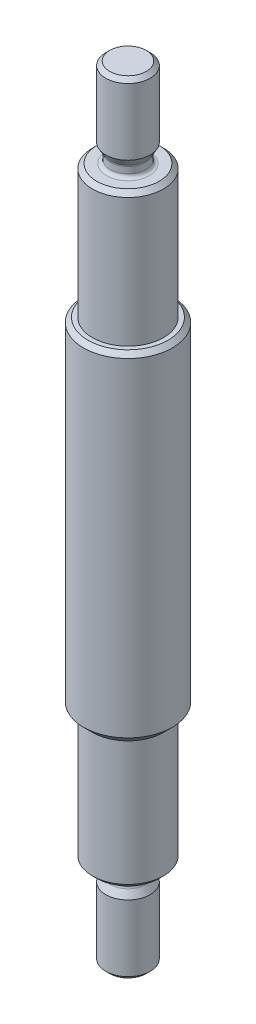
ISO-10303-21;
HEADER;
FILE_DESCRIPTION(('STEP AP214'),'2;1');
FILE_NAME('part.step','',(''),(''),'','','');
FILE_SCHEMA(('AUTOMOTIVE_DESIGN { 1 0 10303 214 1 1 1 1 }'));
ENDSEC;
DATA;
#1=APPLICATION_CONTEXT('core data for automotive mechanical design processes');
#2=APPLICATION_PROTOCOL_DEFINITION('international standard','automotive_design',2000,#1);
#3=PRODUCT_CONTEXT('',#1,'mechanical');
#4=PRODUCT('Part','Part','',(#3));
#5=PRODUCT_RELATED_PRODUCT_CATEGORY('part','',(#4));
#6=PRODUCT_DEFINITION_FORMATION('','',#4);
#7=PRODUCT_DEFINITION_CONTEXT('part definition',#1,'design');
#8=PRODUCT_DEFINITION('design','',#6,#7);
#9=PRODUCT_DEFINITION_SHAPE('','',#8);
#10=(LENGTH_UNIT() NAMED_UNIT(*) SI_UNIT(.MILLI.,.METRE.));
#11=(NAMED_UNIT(*) PLANE_ANGLE_UNIT() SI_UNIT($,.RADIAN.));
#12=(NAMED_UNIT(*) SI_UNIT($,.STERADIAN.) SOLID_ANGLE_UNIT());
#13=UNCERTAINTY_MEASURE_WITH_UNIT(LENGTH_MEASURE(1.E-05),#10,'distance_accuracy_value','');
#14=(GEOMETRIC_REPRESENTATION_CONTEXT(3) GLOBAL_UNCERTAINTY_ASSIGNED_CONTEXT((#13)) GLOBAL_UNIT_ASSIGNED_CONTEXT((#10,
#11,#12)) REPRESENTATION_CONTEXT('',''));
#15=CARTESIAN_POINT('',(0.,0.,0.));
#16=DIRECTION('',(0.,0.,1.));
#17=DIRECTION('',(1.,0.,0.));
#18=AXIS2_PLACEMENT_3D('',#15,#16,#17);
#19=CARTESIAN_POINT('',(0.,19.,0.));
#20=DIRECTION('',(0.,-1.,0.));
#21=DIRECTION('',(0.,0.,-1.));
#22=AXIS2_PLACEMENT_3D('',#19,#20,#21);
#23=CYLINDRICAL_SURFACE('',#22,5.);
#24=CARTESIAN_POINT('',(0.,18.5,0.));
#25=DIRECTION('',(0.,1.,0.));
#26=DIRECTION('',(0.,0.,1.));
#27=AXIS2_PLACEMENT_3D('',#24,#25,#26);
#28=CIRCLE('',#27,5.);
#29=CARTESIAN_POINT('',(0.,18.5,5.));
#30=VERTEX_POINT('',#29);
#31=EDGE_CURVE('E10',#30,#30,#28,.F.);
#32=ORIENTED_EDGE('',*,*,#31,.T.);
#33=EDGE_LOOP('',(#32));
#34=FACE_BOUND('',#33,.T.);
#35=CARTESIAN_POINT('',(0.,-18.5,0.));
#36=DIRECTION('',(0.,1.,0.));
#37=DIRECTION('',(0.,0.,1.));
#38=AXIS2_PLACEMENT_3D('',#35,#36,#37);
#39=CIRCLE('',#38,5.);
#40=CARTESIAN_POINT('',(0.,-18.5,5.));
#41=VERTEX_POINT('',#40);
#42=EDGE_CURVE('E53',#41,#41,#39,.T.);
#43=ORIENTED_EDGE('',*,*,#42,.T.);
#44=EDGE_LOOP('',(#43));
#45=FACE_BOUND('',#44,.T.);
#46=ADVANCED_FACE('F43',(#34,#45),#23,.T.);
#47=CARTESIAN_POINT('',(0.,19.,0.));
#48=DIRECTION('',(0.,1.,0.));
#49=DIRECTION('',(0.,0.,1.));
#50=AXIS2_PLACEMENT_3D('',#47,#48,#49);
#51=PLANE('',#50);
#52=CARTESIAN_POINT('',(0.,19.,0.));
#53=DIRECTION('',(0.,1.,0.));
#54=DIRECTION('',(0.,0.,1.));
#55=AXIS2_PLACEMENT_3D('',#52,#53,#54);
#56=CIRCLE('',#55,4.5);
#57=CARTESIAN_POINT('',(0.,19.,4.5));
#58=VERTEX_POINT('',#57);
#59=EDGE_CURVE('E58',#58,#58,#56,.T.);
#60=ORIENTED_EDGE('',*,*,#59,.T.);
#61=EDGE_LOOP('',(#60));
#62=FACE_BOUND('',#61,.T.);
#63=CARTESIAN_POINT('',(0.,19.,0.));
#64=DIRECTION('',(0.,1.,0.));
#65=DIRECTION('',(0.,0.,1.));
#66=AXIS2_PLACEMENT_3D('',#63,#64,#65);
#67=CIRCLE('',#66,4.);
#68=CARTESIAN_POINT('',(0.,19.,4.));
#69=VERTEX_POINT('',#68);
#70=EDGE_CURVE('E84',#69,#69,#67,.T.);
#71=ORIENTED_EDGE('',*,*,#70,.F.);
#72=EDGE_LOOP('',(#71));
#73=FACE_BOUND('',#72,.T.);
#74=ADVANCED_FACE('F162',(#62,#73),#51,.T.);
#75=CARTESIAN_POINT('',(0.,34.,0.));
#76=DIRECTION('',(0.,-1.,0.));
#77=DIRECTION('',(0.,0.,-1.));
#78=AXIS2_PLACEMENT_3D('',#75,#76,#77);
#79=CYLINDRICAL_SURFACE('',#78,4.);
#80=CARTESIAN_POINT('',(0.,33.5,0.));
#81=DIRECTION('',(0.,1.,0.));
#82=DIRECTION('',(0.,0.,1.));
#83=AXIS2_PLACEMENT_3D('',#80,#81,#82);
#84=CIRCLE('',#83,4.);
#85=CARTESIAN_POINT('',(0.,33.5,4.));
#86=VERTEX_POINT('',#85);
#87=EDGE_CURVE('E64',#86,#86,#84,.F.);
#88=ORIENTED_EDGE('',*,*,#87,.T.);
#89=EDGE_LOOP('',(#88));
#90=FACE_BOUND('',#89,.T.);
#91=ORIENTED_EDGE('',*,*,#70,.T.);
#92=EDGE_LOOP('',(#91));
#93=FACE_BOUND('',#92,.T.);
#94=ADVANCED_FACE('F167',(#90,#93),#79,.T.);
#95=CARTESIAN_POINT('',(0.,34.,0.));
#96=DIRECTION('',(0.,1.,0.));
#97=DIRECTION('',(0.,0.,1.));
#98=AXIS2_PLACEMENT_3D('',#95,#96,#97);
#99=PLANE('',#98);
#100=CARTESIAN_POINT('',(0.,34.,0.));
#101=DIRECTION('',(0.,1.,0.));
#102=DIRECTION('',(0.,0.,1.));
#103=AXIS2_PLACEMENT_3D('',#100,#101,#102);
#104=CIRCLE('',#103,3.5);
#105=CARTESIAN_POINT('',(0.,34.,3.5));
#106=VERTEX_POINT('',#105);
#107=EDGE_CURVE('E68',#106,#106,#104,.T.);
#108=ORIENTED_EDGE('',*,*,#107,.T.);
#109=EDGE_LOOP('',(#108));
#110=FACE_BOUND('',#109,.T.);
#111=CARTESIAN_POINT('',(0.,34.,0.));
#112=DIRECTION('',(0.,-1.,0.));
#113=DIRECTION('',(0.,0.,-1.));
#114=AXIS2_PLACEMENT_3D('',#111,#112,#113);
#115=CIRCLE('',#114,2.4);
#116=CARTESIAN_POINT('',(0.,34.,-2.4));
#117=VERTEX_POINT('',#116);
#118=EDGE_CURVE('E132',#117,#117,#115,.T.);
#119=ORIENTED_EDGE('',*,*,#118,.T.);
#120=EDGE_LOOP('',(#119));
#121=FACE_BOUND('',#120,.T.);
#122=ADVANCED_FACE('F209',(#110,#121),#99,.T.);
#123=CARTESIAN_POINT('',(0.,-34.,0.));
#124=DIRECTION('',(0.,1.,0.));
#125=DIRECTION('',(0.,0.,1.));
#126=AXIS2_PLACEMENT_3D('',#123,#124,#125);
#127=CYLINDRICAL_SURFACE('',#126,4.);
#128=CARTESIAN_POINT('',(0.,-19.5,0.));
#129=DIRECTION('',(0.,1.,0.));
#130=DIRECTION('',(0.,0.,1.));
#131=AXIS2_PLACEMENT_3D('',#128,#129,#130);
#132=CIRCLE('',#131,4.);
#133=CARTESIAN_POINT('',(0.,-19.5,4.));
#134=VERTEX_POINT('',#133);
#135=EDGE_CURVE('E76',#134,#134,#132,.F.);
#136=ORIENTED_EDGE('',*,*,#135,.T.);
#137=EDGE_LOOP('',(#136));
#138=FACE_BOUND('',#137,.T.);
#139=CARTESIAN_POINT('',(0.,-33.5,0.));
#140=DIRECTION('',(0.,1.,0.));
#141=DIRECTION('',(0.,0.,1.));
#142=AXIS2_PLACEMENT_3D('',#139,#140,#141);
#143=CIRCLE('',#142,4.);
#144=CARTESIAN_POINT('',(0.,-33.5,4.));
#145=VERTEX_POINT('',#144);
#146=EDGE_CURVE('E80',#145,#145,#143,.T.);
#147=ORIENTED_EDGE('',*,*,#146,.T.);
#148=EDGE_LOOP('',(#147));
#149=FACE_BOUND('',#148,.T.);
#150=ADVANCED_FACE('F212',(#138,#149),#127,.T.);
#151=CARTESIAN_POINT('',(0.,-34.,0.));
#152=DIRECTION('',(0.,1.,0.));
#153=DIRECTION('',(0.,0.,1.));
#154=AXIS2_PLACEMENT_3D('',#151,#152,#153);
#155=PLANE('',#154);
#156=CARTESIAN_POINT('',(0.,-34.,0.));
#157=DIRECTION('',(0.,1.,0.));
#158=DIRECTION('',(0.,0.,1.));
#159=AXIS2_PLACEMENT_3D('',#156,#157,#158);
#160=CIRCLE('',#159,3.50000000000003);
#161=CARTESIAN_POINT('',(0.,-34.,3.50000000000003));
#162=VERTEX_POINT('',#161);
#163=EDGE_CURVE('E72',#162,#162,#160,.F.);
#164=ORIENTED_EDGE('',*,*,#163,.T.);
#165=EDGE_LOOP('',(#164));
#166=FACE_BOUND('',#165,.T.);
#167=CARTESIAN_POINT('',(0.,-34.,0.));
#168=DIRECTION('',(0.,1.,0.));
#169=DIRECTION('',(0.,0.,1.));
#170=AXIS2_PLACEMENT_3D('',#167,#168,#169);
#171=CIRCLE('',#170,2.4);
#172=CARTESIAN_POINT('',(0.,-34.,2.4));
#173=VERTEX_POINT('',#172);
#174=EDGE_CURVE('E104',#173,#173,#171,.T.);
#175=ORIENTED_EDGE('',*,*,#174,.T.);
#176=EDGE_LOOP('',(#175));
#177=FACE_BOUND('',#176,.T.);
#178=ADVANCED_FACE('F188',(#166,#177),#155,.F.);
#179=CARTESIAN_POINT('',(0.,-18.5,0.));
#180=DIRECTION('',(0.,1.,0.));
#181=DIRECTION('',(0.,0.,1.));
#182=AXIS2_PLACEMENT_3D('',#179,#180,#181);
#183=CONICAL_SURFACE('',#182,5.,0.785398163397458);
#184=ORIENTED_EDGE('',*,*,#42,.F.);
#185=EDGE_LOOP('',(#184));
#186=FACE_BOUND('',#185,.T.);
#187=CARTESIAN_POINT('',(0.,-19.,0.));
#188=DIRECTION('',(0.,1.,0.));
#189=DIRECTION('',(0.,0.,1.));
#190=AXIS2_PLACEMENT_3D('',#187,#188,#189);
#191=CIRCLE('',#190,4.49999999999998);
#192=CARTESIAN_POINT('',(0.,-19.,4.49999999999998));
#193=VERTEX_POINT('',#192);
#194=EDGE_CURVE('E48',#193,#193,#191,.F.);
#195=ORIENTED_EDGE('',*,*,#194,.F.);
#196=EDGE_LOOP('',(#195));
#197=FACE_BOUND('',#196,.T.);
#198=ADVANCED_FACE('F182',(#186,#197),#183,.T.);
#199=CARTESIAN_POINT('',(0.,-19.,0.));
#200=DIRECTION('',(0.,1.,0.));
#201=DIRECTION('',(0.,0.,1.));
#202=AXIS2_PLACEMENT_3D('',#199,#200,#201);
#203=CONICAL_SURFACE('',#202,4.50000000000001,0.785398163397455);
#204=ORIENTED_EDGE('',*,*,#135,.F.);
#205=EDGE_LOOP('',(#204));
#206=FACE_BOUND('',#205,.T.);
#207=ORIENTED_EDGE('',*,*,#194,.T.);
#208=EDGE_LOOP('',(#207));
#209=FACE_BOUND('',#208,.T.);
#210=ADVANCED_FACE('F174',(#206,#209),#203,.T.);
#211=CARTESIAN_POINT('',(0.,-33.5,0.));
#212=DIRECTION('',(0.,1.,0.));
#213=DIRECTION('',(0.,0.,1.));
#214=AXIS2_PLACEMENT_3D('',#211,#212,#213);
#215=CONICAL_SURFACE('',#214,4.,0.785398163397445);
#216=ORIENTED_EDGE('',*,*,#163,.F.);
#217=EDGE_LOOP('',(#216));
#218=FACE_BOUND('',#217,.T.);
#219=ORIENTED_EDGE('',*,*,#146,.F.);
#220=EDGE_LOOP('',(#219));
#221=FACE_BOUND('',#220,.T.);
#222=ADVANCED_FACE('F181',(#218,#221),#215,.T.);
#223=CARTESIAN_POINT('',(0.,34.,0.));
#224=DIRECTION('',(0.,-1.,0.));
#225=DIRECTION('',(0.,0.,-1.));
#226=AXIS2_PLACEMENT_3D('',#223,#224,#225);
#227=CONICAL_SURFACE('',#226,3.5,0.785398163397445);
#228=ORIENTED_EDGE('',*,*,#87,.F.);
#229=EDGE_LOOP('',(#228));
#230=FACE_BOUND('',#229,.T.);
#231=ORIENTED_EDGE('',*,*,#107,.F.);
#232=EDGE_LOOP('',(#231));
#233=FACE_BOUND('',#232,.T.);
#234=ADVANCED_FACE('F194',(#230,#233),#227,.T.);
#235=CARTESIAN_POINT('',(0.,19.,0.));
#236=DIRECTION('',(0.,-1.,0.));
#237=DIRECTION('',(0.,0.,-1.));
#238=AXIS2_PLACEMENT_3D('',#235,#236,#237);
#239=CONICAL_SURFACE('',#238,4.5,0.785398163397444);
#240=ORIENTED_EDGE('',*,*,#31,.F.);
#241=EDGE_LOOP('',(#240));
#242=FACE_BOUND('',#241,.T.);
#243=ORIENTED_EDGE('',*,*,#59,.F.);
#244=EDGE_LOOP('',(#243));
#245=FACE_BOUND('',#244,.T.);
#246=ADVANCED_FACE('F46',(#242,#245),#239,.T.);
#247=CARTESIAN_POINT('',(0.,-44.,0.));
#248=DIRECTION('',(0.,1.,0.));
#249=DIRECTION('',(0.,0.,1.));
#250=AXIS2_PLACEMENT_3D('',#247,#248,#249);
#251=CYLINDRICAL_SURFACE('',#250,2.5);
#252=CARTESIAN_POINT('',(0.,-36.0732050807569,0.));
#253=DIRECTION('',(0.,1.,0.));
#254=DIRECTION('',(0.,0.,1.));
#255=AXIS2_PLACEMENT_3D('',#252,#253,#254);
#256=CIRCLE('',#255,2.5);
#257=CARTESIAN_POINT('',(0.,-36.0732050807569,2.5));
#258=VERTEX_POINT('',#257);
#259=EDGE_CURVE('E88',#258,#258,#256,.T.);
#260=ORIENTED_EDGE('',*,*,#259,.F.);
#261=EDGE_LOOP('',(#260));
#262=FACE_BOUND('',#261,.T.);
#263=CARTESIAN_POINT('',(0.,-43.555,0.));
#264=DIRECTION('',(0.,1.,0.));
#265=DIRECTION('',(0.,0.,1.));
#266=AXIS2_PLACEMENT_3D('',#263,#264,#265);
#267=CIRCLE('',#266,2.5);
#268=CARTESIAN_POINT('',(0.,-43.555,2.5));
#269=VERTEX_POINT('',#268);
#270=EDGE_CURVE('E112',#269,#269,#267,.T.);
#271=ORIENTED_EDGE('',*,*,#270,.T.);
#272=EDGE_LOOP('',(#271));
#273=FACE_BOUND('',#272,.T.);
#274=ADVANCED_FACE('F203',(#262,#273),#251,.T.);
#275=CARTESIAN_POINT('',(0.,-36.0732050807569,0.));
#276=DIRECTION('',(0.,-1.,0.));
#277=DIRECTION('',(0.,0.,-1.));
#278=AXIS2_PLACEMENT_3D('',#275,#276,#277);
#279=CONICAL_SURFACE('',#278,2.5,0.523598775598274);
#280=CARTESIAN_POINT('',(0.,-35.3,0.));
#281=DIRECTION('',(0.,1.,0.));
#282=DIRECTION('',(0.,0.,1.));
#283=AXIS2_PLACEMENT_3D('',#280,#281,#282);
#284=CIRCLE('',#283,2.05358983848622);
#285=CARTESIAN_POINT('',(0.,-35.3,2.05358983848622));
#286=VERTEX_POINT('',#285);
#287=EDGE_CURVE('E92',#286,#286,#284,.T.);
#288=ORIENTED_EDGE('',*,*,#287,.F.);
#289=EDGE_LOOP('',(#288));
#290=FACE_BOUND('',#289,.T.);
#291=ORIENTED_EDGE('',*,*,#259,.T.);
#292=EDGE_LOOP('',(#291));
#293=FACE_BOUND('',#292,.T.);
#294=ADVANCED_FACE('F315',(#290,#293),#279,.T.);
#295=CARTESIAN_POINT('',(0.,-35.1,0.));
#296=DIRECTION('',(0.,1.,0.));
#297=DIRECTION('',(0.,0.,1.));
#298=AXIS2_PLACEMENT_3D('',#295,#296,#297);
#299=TOROIDAL_SURFACE('',#298,2.4,0.4);
#300=CARTESIAN_POINT('',(0.,-35.1,0.));
#301=DIRECTION('',(0.,1.,0.));
#302=DIRECTION('',(0.,0.,1.));
#303=AXIS2_PLACEMENT_3D('',#300,#301,#302);
#304=CIRCLE('',#303,2.);
#305=CARTESIAN_POINT('',(0.,-35.1,2.));
#306=VERTEX_POINT('',#305);
#307=EDGE_CURVE('E96',#306,#306,#304,.T.);
#308=ORIENTED_EDGE('',*,*,#307,.F.);
#309=EDGE_LOOP('',(#308));
#310=FACE_BOUND('',#309,.T.);
#311=ORIENTED_EDGE('',*,*,#287,.T.);
#312=EDGE_LOOP('',(#311));
#313=FACE_BOUND('',#312,.T.);
#314=ADVANCED_FACE('F323',(#310,#313),#299,.F.);
#315=CARTESIAN_POINT('',(0.,-44.,0.));
#316=DIRECTION('',(0.,1.,0.));
#317=DIRECTION('',(0.,0.,1.));
#318=AXIS2_PLACEMENT_3D('',#315,#316,#317);
#319=CYLINDRICAL_SURFACE('',#318,2.);
#320=CARTESIAN_POINT('',(0.,-34.4,0.));
#321=DIRECTION('',(0.,1.,0.));
#322=DIRECTION('',(0.,0.,1.));
#323=AXIS2_PLACEMENT_3D('',#320,#321,#322);
#324=CIRCLE('',#323,2.);
#325=CARTESIAN_POINT('',(0.,-34.4,2.));
#326=VERTEX_POINT('',#325);
#327=EDGE_CURVE('E100',#326,#326,#324,.T.);
#328=ORIENTED_EDGE('',*,*,#327,.F.);
#329=EDGE_LOOP('',(#328));
#330=FACE_BOUND('',#329,.T.);
#331=ORIENTED_EDGE('',*,*,#307,.T.);
#332=EDGE_LOOP('',(#331));
#333=FACE_BOUND('',#332,.T.);
#334=ADVANCED_FACE('F330',(#330,#333),#319,.T.);
#335=CARTESIAN_POINT('',(0.,-34.4,0.));
#336=DIRECTION('',(0.,1.,0.));
#337=DIRECTION('',(0.,0.,1.));
#338=AXIS2_PLACEMENT_3D('',#335,#336,#337);
#339=TOROIDAL_SURFACE('',#338,2.4,0.4);
#340=ORIENTED_EDGE('',*,*,#174,.F.);
#341=EDGE_LOOP('',(#340));
#342=FACE_BOUND('',#341,.T.);
#343=ORIENTED_EDGE('',*,*,#327,.T.);
#344=EDGE_LOOP('',(#343));
#345=FACE_BOUND('',#344,.T.);
#346=ADVANCED_FACE('F250',(#342,#345),#339,.F.);
#347=CARTESIAN_POINT('',(0.,-44.,0.));
#348=DIRECTION('',(0.,1.,0.));
#349=DIRECTION('',(0.,0.,1.));
#350=AXIS2_PLACEMENT_3D('',#347,#348,#349);
#351=CONICAL_SURFACE('',#350,2.055,0.785398163397455);
#352=ORIENTED_EDGE('',*,*,#270,.F.);
#353=EDGE_LOOP('',(#352));
#354=FACE_BOUND('',#353,.T.);
#355=CARTESIAN_POINT('',(0.,-44.,0.));
#356=DIRECTION('',(0.,1.,0.));
#357=DIRECTION('',(0.,0.,1.));
#358=AXIS2_PLACEMENT_3D('',#355,#356,#357);
#359=CIRCLE('',#358,2.055);
#360=CARTESIAN_POINT('',(0.,-44.,2.055));
#361=VERTEX_POINT('',#360);
#362=EDGE_CURVE('E108',#361,#361,#359,.T.);
#363=ORIENTED_EDGE('',*,*,#362,.T.);
#364=EDGE_LOOP('',(#363));
#365=FACE_BOUND('',#364,.T.);
#366=ADVANCED_FACE('F244',(#354,#365),#351,.T.);
#367=CARTESIAN_POINT('',(0.,-44.,0.));
#368=DIRECTION('',(0.,-1.,0.));
#369=DIRECTION('',(0.,0.,-1.));
#370=AXIS2_PLACEMENT_3D('',#367,#368,#369);
#371=PLANE('',#370);
#372=ORIENTED_EDGE('',*,*,#362,.F.);
#373=EDGE_LOOP('',(#372));
#374=FACE_BOUND('',#373,.T.);
#375=ADVANCED_FACE('F240',(#374),#371,.T.);
#376=CARTESIAN_POINT('',(0.,44.,0.));
#377=DIRECTION('',(0.,-1.,0.));
#378=DIRECTION('',(0.,0.,-1.));
#379=AXIS2_PLACEMENT_3D('',#376,#377,#378);
#380=CYLINDRICAL_SURFACE('',#379,2.5);
#381=CARTESIAN_POINT('',(0.,36.0732050807569,0.));
#382=DIRECTION('',(0.,-1.,0.));
#383=DIRECTION('',(0.,0.,-1.));
#384=AXIS2_PLACEMENT_3D('',#381,#382,#383);
#385=CIRCLE('',#384,2.5);
#386=CARTESIAN_POINT('',(0.,36.0732050807569,-2.5));
#387=VERTEX_POINT('',#386);
#388=EDGE_CURVE('E116',#387,#387,#385,.T.);
#389=ORIENTED_EDGE('',*,*,#388,.F.);
#390=EDGE_LOOP('',(#389));
#391=FACE_BOUND('',#390,.T.);
#392=CARTESIAN_POINT('',(0.,43.555,0.));
#393=DIRECTION('',(0.,-1.,0.));
#394=DIRECTION('',(0.,0.,-1.));
#395=AXIS2_PLACEMENT_3D('',#392,#393,#394);
#396=CIRCLE('',#395,2.5);
#397=CARTESIAN_POINT('',(0.,43.555,-2.5));
#398=VERTEX_POINT('',#397);
#399=EDGE_CURVE('E140',#398,#398,#396,.T.);
#400=ORIENTED_EDGE('',*,*,#399,.T.);
#401=EDGE_LOOP('',(#400));
#402=FACE_BOUND('',#401,.T.);
#403=ADVANCED_FACE('F145',(#391,#402),#380,.T.);
#404=CARTESIAN_POINT('',(0.,36.0732050807569,0.));
#405=DIRECTION('',(0.,1.,0.));
#406=DIRECTION('',(0.,0.,1.));
#407=AXIS2_PLACEMENT_3D('',#404,#405,#406);
#408=CONICAL_SURFACE('',#407,2.5,0.523598775598274);
#409=CARTESIAN_POINT('',(0.,35.3,0.));
#410=DIRECTION('',(0.,-1.,0.));
#411=DIRECTION('',(0.,0.,-1.));
#412=AXIS2_PLACEMENT_3D('',#409,#410,#411);
#413=CIRCLE('',#412,2.05358983848622);
#414=CARTESIAN_POINT('',(0.,35.3,-2.05358983848622));
#415=VERTEX_POINT('',#414);
#416=EDGE_CURVE('E120',#415,#415,#413,.T.);
#417=ORIENTED_EDGE('',*,*,#416,.F.);
#418=EDGE_LOOP('',(#417));
#419=FACE_BOUND('',#418,.T.);
#420=ORIENTED_EDGE('',*,*,#388,.T.);
#421=EDGE_LOOP('',(#420));
#422=FACE_BOUND('',#421,.T.);
#423=ADVANCED_FACE('F230',(#419,#422),#408,.T.);
#424=CARTESIAN_POINT('',(0.,35.1,0.));
#425=DIRECTION('',(0.,-1.,0.));
#426=DIRECTION('',(0.,0.,-1.));
#427=AXIS2_PLACEMENT_3D('',#424,#425,#426);
#428=TOROIDAL_SURFACE('',#427,2.4,0.4);
#429=CARTESIAN_POINT('',(0.,35.1,0.));
#430=DIRECTION('',(0.,-1.,0.));
#431=DIRECTION('',(0.,0.,-1.));
#432=AXIS2_PLACEMENT_3D('',#429,#430,#431);
#433=CIRCLE('',#432,2.);
#434=CARTESIAN_POINT('',(0.,35.1,-2.));
#435=VERTEX_POINT('',#434);
#436=EDGE_CURVE('E124',#435,#435,#433,.T.);
#437=ORIENTED_EDGE('',*,*,#436,.F.);
#438=EDGE_LOOP('',(#437));
#439=FACE_BOUND('',#438,.T.);
#440=ORIENTED_EDGE('',*,*,#416,.T.);
#441=EDGE_LOOP('',(#440));
#442=FACE_BOUND('',#441,.T.);
#443=ADVANCED_FACE('F224',(#439,#442),#428,.F.);
#444=CARTESIAN_POINT('',(0.,44.,0.));
#445=DIRECTION('',(0.,-1.,0.));
#446=DIRECTION('',(0.,0.,-1.));
#447=AXIS2_PLACEMENT_3D('',#444,#445,#446);
#448=CYLINDRICAL_SURFACE('',#447,2.);
#449=CARTESIAN_POINT('',(0.,34.4,0.));
#450=DIRECTION('',(0.,-1.,0.));
#451=DIRECTION('',(0.,0.,-1.));
#452=AXIS2_PLACEMENT_3D('',#449,#450,#451);
#453=CIRCLE('',#452,2.);
#454=CARTESIAN_POINT('',(0.,34.4,-2.));
#455=VERTEX_POINT('',#454);
#456=EDGE_CURVE('E128',#455,#455,#453,.T.);
#457=ORIENTED_EDGE('',*,*,#456,.F.);
#458=EDGE_LOOP('',(#457));
#459=FACE_BOUND('',#458,.T.);
#460=ORIENTED_EDGE('',*,*,#436,.T.);
#461=EDGE_LOOP('',(#460));
#462=FACE_BOUND('',#461,.T.);
#463=ADVANCED_FACE('F218',(#459,#462),#448,.T.);
#464=CARTESIAN_POINT('',(0.,34.4,0.));
#465=DIRECTION('',(0.,-1.,0.));
#466=DIRECTION('',(0.,0.,-1.));
#467=AXIS2_PLACEMENT_3D('',#464,#465,#466);
#468=TOROIDAL_SURFACE('',#467,2.4,0.4);
#469=ORIENTED_EDGE('',*,*,#118,.F.);
#470=EDGE_LOOP('',(#469));
#471=FACE_BOUND('',#470,.T.);
#472=ORIENTED_EDGE('',*,*,#456,.T.);
#473=EDGE_LOOP('',(#472));
#474=FACE_BOUND('',#473,.T.);
#475=ADVANCED_FACE('F151',(#471,#474),#468,.F.);
#476=CARTESIAN_POINT('',(0.,44.,0.));
#477=DIRECTION('',(0.,-1.,0.));
#478=DIRECTION('',(0.,0.,-1.));
#479=AXIS2_PLACEMENT_3D('',#476,#477,#478);
#480=CONICAL_SURFACE('',#479,2.055,0.785398163397455);
#481=ORIENTED_EDGE('',*,*,#399,.F.);
#482=EDGE_LOOP('',(#481));
#483=FACE_BOUND('',#482,.T.);
#484=CARTESIAN_POINT('',(0.,44.,0.));
#485=DIRECTION('',(0.,-1.,0.));
#486=DIRECTION('',(0.,0.,-1.));
#487=AXIS2_PLACEMENT_3D('',#484,#485,#486);
#488=CIRCLE('',#487,2.055);
#489=CARTESIAN_POINT('',(0.,44.,-2.055));
#490=VERTEX_POINT('',#489);
#491=EDGE_CURVE('E136',#490,#490,#488,.T.);
#492=ORIENTED_EDGE('',*,*,#491,.T.);
#493=EDGE_LOOP('',(#492));
#494=FACE_BOUND('',#493,.T.);
#495=ADVANCED_FACE('F147',(#483,#494),#480,.T.);
#496=CARTESIAN_POINT('',(0.,44.,0.));
#497=DIRECTION('',(0.,1.,0.));
#498=DIRECTION('',(0.,0.,1.));
#499=AXIS2_PLACEMENT_3D('',#496,#497,#498);
#500=PLANE('',#499);
#501=ORIENTED_EDGE('',*,*,#491,.F.);
#502=EDGE_LOOP('',(#501));
#503=FACE_BOUND('',#502,.T.);
#504=ADVANCED_FACE('F150',(#503),#500,.T.);
#505=CLOSED_SHELL('',(#46,#74,#94,#122,#150,#178,#198,#210,#222,#234,#246,#274,#294,#314,#334,
#346,#366,#375,#403,#423,#443,#463,#475,#495,#504));
#506=MANIFOLD_SOLID_BREP('B2',#505);
#507=ADVANCED_BREP_SHAPE_REPRESENTATION('',(#18,#506),#14);
#508=SHAPE_DEFINITION_REPRESENTATION(#9,#507);
ENDSEC;
END-ISO-10303-21;
